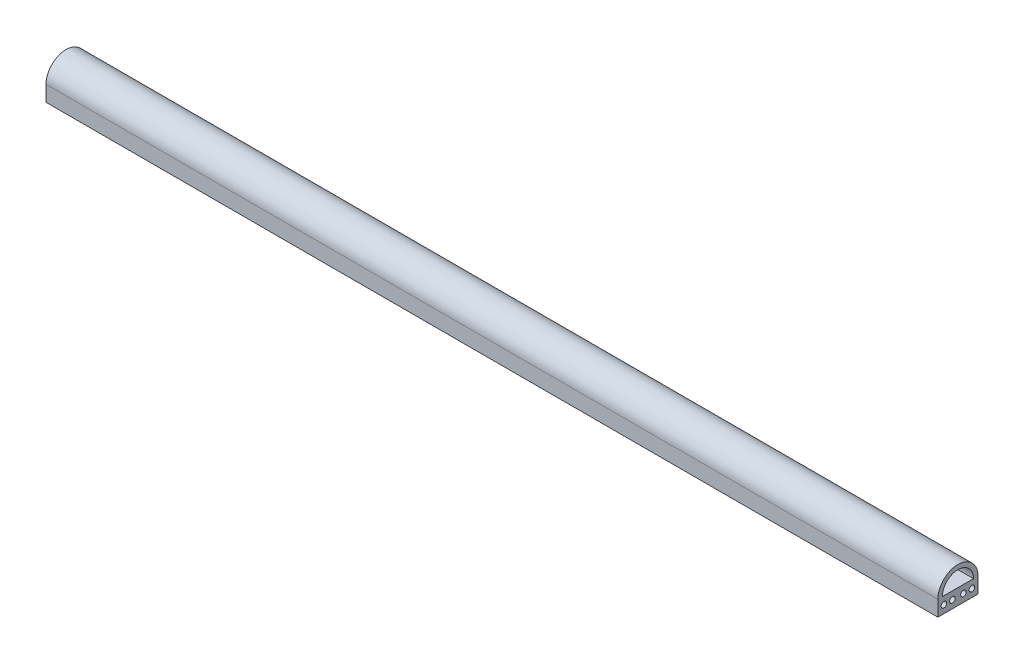
ISO-10303-21;
HEADER;
FILE_DESCRIPTION(('STEP AP214'),'2;1');
FILE_NAME('part.step','',(''),(''),'','','');
FILE_SCHEMA(('AUTOMOTIVE_DESIGN { 1 0 10303 214 1 1 1 1 }'));
ENDSEC;
DATA;
#1=APPLICATION_CONTEXT('core data for automotive mechanical design processes');
#2=APPLICATION_PROTOCOL_DEFINITION('international standard','automotive_design',2000,#1);
#3=PRODUCT_CONTEXT('',#1,'mechanical');
#4=PRODUCT('Part','Part','',(#3));
#5=PRODUCT_RELATED_PRODUCT_CATEGORY('part','',(#4));
#6=PRODUCT_DEFINITION_FORMATION('','',#4);
#7=PRODUCT_DEFINITION_CONTEXT('part definition',#1,'design');
#8=PRODUCT_DEFINITION('design','',#6,#7);
#9=PRODUCT_DEFINITION_SHAPE('','',#8);
#10=(LENGTH_UNIT() NAMED_UNIT(*) SI_UNIT(.MILLI.,.METRE.));
#11=(NAMED_UNIT(*) PLANE_ANGLE_UNIT() SI_UNIT($,.RADIAN.));
#12=(NAMED_UNIT(*) SI_UNIT($,.STERADIAN.) SOLID_ANGLE_UNIT());
#13=UNCERTAINTY_MEASURE_WITH_UNIT(LENGTH_MEASURE(1.E-05),#10,'distance_accuracy_value','');
#14=(GEOMETRIC_REPRESENTATION_CONTEXT(3) GLOBAL_UNCERTAINTY_ASSIGNED_CONTEXT((#13)) GLOBAL_UNIT_ASSIGNED_CONTEXT((#10,
#11,#12)) REPRESENTATION_CONTEXT('',''));
#15=CARTESIAN_POINT('',(0.,0.,0.));
#16=DIRECTION('',(0.,0.,1.));
#17=DIRECTION('',(1.,0.,0.));
#18=AXIS2_PLACEMENT_3D('',#15,#16,#17);
#19=CARTESIAN_POINT('',(-100.,3.5,0.));
#20=DIRECTION('',(1.,0.,0.));
#21=DIRECTION('',(0.,0.,-1.));
#22=AXIS2_PLACEMENT_3D('',#19,#20,#21);
#23=CYLINDRICAL_SURFACE('',#22,4.5);
#24=DIRECTION('',(1.,0.,0.));
#25=VECTOR('',#24,1.);
#26=CARTESIAN_POINT('',(-100.,3.5,4.5));
#27=LINE('',#26,#25);
#28=CARTESIAN_POINT('',(-100.,3.5,4.5));
#29=VERTEX_POINT('',#28);
#30=CARTESIAN_POINT('',(100.,3.5,4.5));
#31=VERTEX_POINT('',#30);
#32=EDGE_CURVE('E37',#29,#31,#27,.T.);
#33=ORIENTED_EDGE('',*,*,#32,.T.);
#34=CARTESIAN_POINT('',(100.,3.5,0.));
#35=DIRECTION('',(1.,0.,0.));
#36=DIRECTION('',(0.,0.,-1.));
#37=AXIS2_PLACEMENT_3D('',#34,#35,#36);
#38=CIRCLE('',#37,4.5);
#39=CARTESIAN_POINT('',(100.,3.5,-4.5));
#40=VERTEX_POINT('',#39);
#41=EDGE_CURVE('E116',#40,#31,#38,.T.);
#42=ORIENTED_EDGE('',*,*,#41,.F.);
#43=DIRECTION('',(1.,0.,0.));
#44=VECTOR('',#43,1.);
#45=CARTESIAN_POINT('',(-100.,3.5,-4.5));
#46=LINE('',#45,#44);
#47=CARTESIAN_POINT('',(-100.,3.5,-4.5));
#48=VERTEX_POINT('',#47);
#49=EDGE_CURVE('E11',#48,#40,#46,.T.);
#50=ORIENTED_EDGE('',*,*,#49,.F.);
#51=CARTESIAN_POINT('',(-100.,3.5,0.));
#52=DIRECTION('',(1.,0.,0.));
#53=DIRECTION('',(0.,0.,-1.));
#54=AXIS2_PLACEMENT_3D('',#51,#52,#53);
#55=CIRCLE('',#54,4.5);
#56=EDGE_CURVE('E143',#48,#29,#55,.T.);
#57=ORIENTED_EDGE('',*,*,#56,.T.);
#58=EDGE_LOOP('',(#33,#42,#50,#57));
#59=FACE_BOUND('',#58,.T.);
#60=ADVANCED_FACE('F34',(#59),#23,.T.);
#61=CARTESIAN_POINT('',(-100.,0.,-4.5));
#62=DIRECTION('',(0.,0.,-1.));
#63=DIRECTION('',(-1.,0.,0.));
#64=AXIS2_PLACEMENT_3D('',#61,#62,#63);
#65=PLANE('',#64);
#66=ORIENTED_EDGE('',*,*,#49,.T.);
#67=DIRECTION('',(0.,1.,0.));
#68=VECTOR('',#67,1.);
#69=CARTESIAN_POINT('',(100.,0.,-4.5));
#70=LINE('',#69,#68);
#71=CARTESIAN_POINT('',(100.,0.,-4.5));
#72=VERTEX_POINT('',#71);
#73=EDGE_CURVE('E125',#72,#40,#70,.T.);
#74=ORIENTED_EDGE('',*,*,#73,.F.);
#75=DIRECTION('',(1.,0.,0.));
#76=VECTOR('',#75,1.);
#77=CARTESIAN_POINT('',(-100.,0.,-4.5));
#78=LINE('',#77,#76);
#79=CARTESIAN_POINT('',(-100.,0.,-4.5));
#80=VERTEX_POINT('',#79);
#81=EDGE_CURVE('E42',#80,#72,#78,.T.);
#82=ORIENTED_EDGE('',*,*,#81,.F.);
#83=DIRECTION('',(0.,1.,0.));
#84=VECTOR('',#83,1.);
#85=CARTESIAN_POINT('',(-100.,0.,-4.5));
#86=LINE('',#85,#84);
#87=EDGE_CURVE('E150',#80,#48,#86,.T.);
#88=ORIENTED_EDGE('',*,*,#87,.T.);
#89=EDGE_LOOP('',(#66,#74,#82,#88));
#90=FACE_BOUND('',#89,.T.);
#91=ADVANCED_FACE('F164',(#90),#65,.T.);
#92=CARTESIAN_POINT('',(-100.,0.,-4.5));
#93=DIRECTION('',(0.,-1.,0.));
#94=DIRECTION('',(0.,0.,-1.));
#95=AXIS2_PLACEMENT_3D('',#92,#93,#94);
#96=PLANE('',#95);
#97=ORIENTED_EDGE('',*,*,#81,.T.);
#98=DIRECTION('',(0.,0.,-1.));
#99=VECTOR('',#98,1.);
#100=CARTESIAN_POINT('',(100.,0.,4.5));
#101=LINE('',#100,#99);
#102=CARTESIAN_POINT('',(100.,0.,4.5));
#103=VERTEX_POINT('',#102);
#104=EDGE_CURVE('E122',#103,#72,#101,.T.);
#105=ORIENTED_EDGE('',*,*,#104,.F.);
#106=DIRECTION('',(1.,0.,0.));
#107=VECTOR('',#106,1.);
#108=CARTESIAN_POINT('',(-100.,0.,4.5));
#109=LINE('',#108,#107);
#110=CARTESIAN_POINT('',(-100.,0.,4.5));
#111=VERTEX_POINT('',#110);
#112=EDGE_CURVE('E153',#111,#103,#109,.T.);
#113=ORIENTED_EDGE('',*,*,#112,.F.);
#114=DIRECTION('',(0.,0.,-1.));
#115=VECTOR('',#114,1.);
#116=CARTESIAN_POINT('',(-100.,0.,4.5));
#117=LINE('',#116,#115);
#118=EDGE_CURVE('E148',#111,#80,#117,.T.);
#119=ORIENTED_EDGE('',*,*,#118,.T.);
#120=EDGE_LOOP('',(#97,#105,#113,#119));
#121=FACE_BOUND('',#120,.T.);
#122=ADVANCED_FACE('F170',(#121),#96,.T.);
#123=CARTESIAN_POINT('',(-100.,0.,4.5));
#124=DIRECTION('',(0.,0.,1.));
#125=DIRECTION('',(0.,-1.,0.));
#126=AXIS2_PLACEMENT_3D('',#123,#124,#125);
#127=PLANE('',#126);
#128=ORIENTED_EDGE('',*,*,#112,.T.);
#129=DIRECTION('',(0.,-1.,0.));
#130=VECTOR('',#129,1.);
#131=CARTESIAN_POINT('',(100.,0.,4.5));
#132=LINE('',#131,#130);
#133=EDGE_CURVE('E119',#31,#103,#132,.T.);
#134=ORIENTED_EDGE('',*,*,#133,.F.);
#135=ORIENTED_EDGE('',*,*,#32,.F.);
#136=DIRECTION('',(0.,-1.,0.));
#137=VECTOR('',#136,1.);
#138=CARTESIAN_POINT('',(-100.,0.,4.5));
#139=LINE('',#138,#137);
#140=EDGE_CURVE('E145',#29,#111,#139,.T.);
#141=ORIENTED_EDGE('',*,*,#140,.T.);
#142=EDGE_LOOP('',(#128,#134,#135,#141));
#143=FACE_BOUND('',#142,.T.);
#144=ADVANCED_FACE('F157',(#143),#127,.T.);
#145=CARTESIAN_POINT('',(-100.,3.5,0.));
#146=DIRECTION('',(1.,0.,0.));
#147=DIRECTION('',(0.,0.,-1.));
#148=AXIS2_PLACEMENT_3D('',#145,#146,#147);
#149=PLANE('',#148);
#150=DIRECTION('',(0.,0.,-1.));
#151=VECTOR('',#150,1.);
#152=CARTESIAN_POINT('',(-100.,3.5,-3.49072719459126));
#153=LINE('',#152,#151);
#154=CARTESIAN_POINT('',(-100.,3.5,3.49072719459126));
#155=VERTEX_POINT('',#154);
#156=CARTESIAN_POINT('',(-100.,3.5,-3.49072719459126));
#157=VERTEX_POINT('',#156);
#158=EDGE_CURVE('E129',#155,#157,#153,.T.);
#159=ORIENTED_EDGE('',*,*,#158,.T.);
#160=CARTESIAN_POINT('',(-100.,3.5,0.));
#161=DIRECTION('',(1.,0.,0.));
#162=DIRECTION('',(0.,0.,-1.));
#163=AXIS2_PLACEMENT_3D('',#160,#161,#162);
#164=CIRCLE('',#163,3.49072719459126);
#165=EDGE_CURVE('E50',#157,#155,#164,.T.);
#166=ORIENTED_EDGE('',*,*,#165,.T.);
#167=EDGE_LOOP('',(#159,#166));
#168=FACE_BOUND('',#167,.T.);
#169=CARTESIAN_POINT('',(-100.,1.75,-3.13405881315633));
#170=DIRECTION('',(1.,0.,0.));
#171=DIRECTION('',(0.,0.,1.));
#172=AXIS2_PLACEMENT_3D('',#169,#170,#171);
#173=CIRCLE('',#172,0.625);
#174=CARTESIAN_POINT('',(-100.,1.75,-2.50905881315633));
#175=VERTEX_POINT('',#174);
#176=EDGE_CURVE('E94',#175,#175,#173,.T.);
#177=ORIENTED_EDGE('',*,*,#176,.T.);
#178=EDGE_LOOP('',(#177));
#179=FACE_BOUND('',#178,.T.);
#180=CARTESIAN_POINT('',(-100.,1.75,-1.22483394782814));
#181=DIRECTION('',(1.,0.,0.));
#182=DIRECTION('',(0.,0.,1.));
#183=AXIS2_PLACEMENT_3D('',#180,#181,#182);
#184=CIRCLE('',#183,0.625);
#185=CARTESIAN_POINT('',(-100.,1.75,-0.599833947828144));
#186=VERTEX_POINT('',#185);
#187=EDGE_CURVE('E134',#186,#186,#184,.T.);
#188=ORIENTED_EDGE('',*,*,#187,.T.);
#189=EDGE_LOOP('',(#188));
#190=FACE_BOUND('',#189,.T.);
#191=CARTESIAN_POINT('',(-100.,1.75,1.22483394782814));
#192=DIRECTION('',(1.,0.,0.));
#193=DIRECTION('',(0.,0.,-1.));
#194=AXIS2_PLACEMENT_3D('',#191,#192,#193);
#195=CIRCLE('',#194,0.625);
#196=CARTESIAN_POINT('',(-100.,1.75,0.599833947828144));
#197=VERTEX_POINT('',#196);
#198=EDGE_CURVE('E137',#197,#197,#195,.T.);
#199=ORIENTED_EDGE('',*,*,#198,.T.);
#200=EDGE_LOOP('',(#199));
#201=FACE_BOUND('',#200,.T.);
#202=CARTESIAN_POINT('',(-100.,1.75,3.13405881315633));
#203=DIRECTION('',(1.,0.,0.));
#204=DIRECTION('',(0.,0.,-1.));
#205=AXIS2_PLACEMENT_3D('',#202,#203,#204);
#206=CIRCLE('',#205,0.625);
#207=CARTESIAN_POINT('',(-100.,1.75,2.50905881315633));
#208=VERTEX_POINT('',#207);
#209=EDGE_CURVE('E140',#208,#208,#206,.T.);
#210=ORIENTED_EDGE('',*,*,#209,.T.);
#211=EDGE_LOOP('',(#210));
#212=FACE_BOUND('',#211,.T.);
#213=ORIENTED_EDGE('',*,*,#56,.F.);
#214=ORIENTED_EDGE('',*,*,#87,.F.);
#215=ORIENTED_EDGE('',*,*,#118,.F.);
#216=ORIENTED_EDGE('',*,*,#140,.F.);
#217=EDGE_LOOP('',(#213,#214,#215,#216));
#218=FACE_BOUND('',#217,.T.);
#219=ADVANCED_FACE('F168',(#168,#179,#190,#201,#212,#218),#149,.F.);
#220=CARTESIAN_POINT('',(-100.,1.75,3.13405881315633));
#221=DIRECTION('',(1.,0.,0.));
#222=DIRECTION('',(0.,0.,-1.));
#223=AXIS2_PLACEMENT_3D('',#220,#221,#222);
#224=CYLINDRICAL_SURFACE('',#223,0.625);
#225=ORIENTED_EDGE('',*,*,#209,.F.);
#226=EDGE_LOOP('',(#225));
#227=FACE_BOUND('',#226,.T.);
#228=CARTESIAN_POINT('',(100.,1.75,3.13405881315633));
#229=DIRECTION('',(1.,0.,0.));
#230=DIRECTION('',(0.,0.,-1.));
#231=AXIS2_PLACEMENT_3D('',#228,#229,#230);
#232=CIRCLE('',#231,0.625);
#233=CARTESIAN_POINT('',(100.,1.75,2.50905881315633));
#234=VERTEX_POINT('',#233);
#235=EDGE_CURVE('E113',#234,#234,#232,.T.);
#236=ORIENTED_EDGE('',*,*,#235,.T.);
#237=EDGE_LOOP('',(#236));
#238=FACE_BOUND('',#237,.T.);
#239=ADVANCED_FACE('F205',(#227,#238),#224,.F.);
#240=CARTESIAN_POINT('',(-100.,1.75,1.22483394782814));
#241=DIRECTION('',(1.,0.,0.));
#242=DIRECTION('',(0.,0.,-1.));
#243=AXIS2_PLACEMENT_3D('',#240,#241,#242);
#244=CYLINDRICAL_SURFACE('',#243,0.625);
#245=ORIENTED_EDGE('',*,*,#198,.F.);
#246=EDGE_LOOP('',(#245));
#247=FACE_BOUND('',#246,.T.);
#248=CARTESIAN_POINT('',(100.,1.75,1.22483394782814));
#249=DIRECTION('',(1.,0.,0.));
#250=DIRECTION('',(0.,0.,-1.));
#251=AXIS2_PLACEMENT_3D('',#248,#249,#250);
#252=CIRCLE('',#251,0.625);
#253=CARTESIAN_POINT('',(100.,1.75,0.599833947828144));
#254=VERTEX_POINT('',#253);
#255=EDGE_CURVE('E110',#254,#254,#252,.T.);
#256=ORIENTED_EDGE('',*,*,#255,.T.);
#257=EDGE_LOOP('',(#256));
#258=FACE_BOUND('',#257,.T.);
#259=ADVANCED_FACE('F215',(#247,#258),#244,.F.);
#260=CARTESIAN_POINT('',(-100.,1.75,-1.22483394782814));
#261=DIRECTION('',(1.,0.,0.));
#262=DIRECTION('',(0.,0.,-1.));
#263=AXIS2_PLACEMENT_3D('',#260,#261,#262);
#264=CYLINDRICAL_SURFACE('',#263,0.625);
#265=ORIENTED_EDGE('',*,*,#187,.F.);
#266=EDGE_LOOP('',(#265));
#267=FACE_BOUND('',#266,.T.);
#268=CARTESIAN_POINT('',(100.,1.75,-1.22483394782814));
#269=DIRECTION('',(1.,0.,0.));
#270=DIRECTION('',(0.,0.,1.));
#271=AXIS2_PLACEMENT_3D('',#268,#269,#270);
#272=CIRCLE('',#271,0.625);
#273=CARTESIAN_POINT('',(100.,1.75,-0.599833947828144));
#274=VERTEX_POINT('',#273);
#275=EDGE_CURVE('E107',#274,#274,#272,.T.);
#276=ORIENTED_EDGE('',*,*,#275,.T.);
#277=EDGE_LOOP('',(#276));
#278=FACE_BOUND('',#277,.T.);
#279=ADVANCED_FACE('F225',(#267,#278),#264,.F.);
#280=CARTESIAN_POINT('',(-100.,1.75,-3.13405881315633));
#281=DIRECTION('',(1.,0.,0.));
#282=DIRECTION('',(0.,0.,-1.));
#283=AXIS2_PLACEMENT_3D('',#280,#281,#282);
#284=CYLINDRICAL_SURFACE('',#283,0.625);
#285=ORIENTED_EDGE('',*,*,#176,.F.);
#286=EDGE_LOOP('',(#285));
#287=FACE_BOUND('',#286,.T.);
#288=CARTESIAN_POINT('',(100.,1.75,-3.13405881315633));
#289=DIRECTION('',(1.,0.,0.));
#290=DIRECTION('',(0.,0.,1.));
#291=AXIS2_PLACEMENT_3D('',#288,#289,#290);
#292=CIRCLE('',#291,0.625);
#293=CARTESIAN_POINT('',(100.,1.75,-2.50905881315633));
#294=VERTEX_POINT('',#293);
#295=EDGE_CURVE('E100',#294,#294,#292,.T.);
#296=ORIENTED_EDGE('',*,*,#295,.T.);
#297=EDGE_LOOP('',(#296));
#298=FACE_BOUND('',#297,.T.);
#299=ADVANCED_FACE('F235',(#287,#298),#284,.F.);
#300=CARTESIAN_POINT('',(-100.,3.5,0.));
#301=DIRECTION('',(1.,0.,0.));
#302=DIRECTION('',(0.,0.,-1.));
#303=AXIS2_PLACEMENT_3D('',#300,#301,#302);
#304=CYLINDRICAL_SURFACE('',#303,3.49072719459126);
#305=DIRECTION('',(1.,0.,0.));
#306=VECTOR('',#305,1.);
#307=CARTESIAN_POINT('',(-100.,3.5,-3.49072719459126));
#308=LINE('',#307,#306);
#309=CARTESIAN_POINT('',(100.,3.5,-3.49072719459126));
#310=VERTEX_POINT('',#309);
#311=EDGE_CURVE('E85',#157,#310,#308,.T.);
#312=ORIENTED_EDGE('',*,*,#311,.T.);
#313=CARTESIAN_POINT('',(100.,3.5,0.));
#314=DIRECTION('',(1.,0.,0.));
#315=DIRECTION('',(0.,0.,-1.));
#316=AXIS2_PLACEMENT_3D('',#313,#314,#315);
#317=CIRCLE('',#316,3.49072719459126);
#318=CARTESIAN_POINT('',(100.,3.5,3.49072719459126));
#319=VERTEX_POINT('',#318);
#320=EDGE_CURVE('E89',#310,#319,#317,.T.);
#321=ORIENTED_EDGE('',*,*,#320,.T.);
#322=DIRECTION('',(1.,0.,0.));
#323=VECTOR('',#322,1.);
#324=CARTESIAN_POINT('',(-100.,3.5,3.49072719459126));
#325=LINE('',#324,#323);
#326=EDGE_CURVE('E95',#155,#319,#325,.T.);
#327=ORIENTED_EDGE('',*,*,#326,.F.);
#328=ORIENTED_EDGE('',*,*,#165,.F.);
#329=EDGE_LOOP('',(#312,#321,#327,#328));
#330=FACE_BOUND('',#329,.T.);
#331=ADVANCED_FACE('F87',(#330),#304,.F.);
#332=CARTESIAN_POINT('',(-100.,3.5,-3.49072719459126));
#333=DIRECTION('',(0.,-1.,0.));
#334=DIRECTION('',(0.,0.,-1.));
#335=AXIS2_PLACEMENT_3D('',#332,#333,#334);
#336=PLANE('',#335);
#337=ORIENTED_EDGE('',*,*,#326,.T.);
#338=DIRECTION('',(0.,0.,-1.));
#339=VECTOR('',#338,1.);
#340=CARTESIAN_POINT('',(100.,3.5,-3.49072719459126));
#341=LINE('',#340,#339);
#342=EDGE_CURVE('E97',#319,#310,#341,.T.);
#343=ORIENTED_EDGE('',*,*,#342,.T.);
#344=ORIENTED_EDGE('',*,*,#311,.F.);
#345=ORIENTED_EDGE('',*,*,#158,.F.);
#346=EDGE_LOOP('',(#337,#343,#344,#345));
#347=FACE_BOUND('',#346,.T.);
#348=ADVANCED_FACE('F98',(#347),#336,.F.);
#349=CARTESIAN_POINT('',(100.,3.5,0.));
#350=DIRECTION('',(1.,0.,0.));
#351=DIRECTION('',(0.,0.,-1.));
#352=AXIS2_PLACEMENT_3D('',#349,#350,#351);
#353=PLANE('',#352);
#354=ORIENTED_EDGE('',*,*,#275,.F.);
#355=EDGE_LOOP('',(#354));
#356=FACE_BOUND('',#355,.T.);
#357=ORIENTED_EDGE('',*,*,#235,.F.);
#358=EDGE_LOOP('',(#357));
#359=FACE_BOUND('',#358,.T.);
#360=ORIENTED_EDGE('',*,*,#41,.T.);
#361=ORIENTED_EDGE('',*,*,#133,.T.);
#362=ORIENTED_EDGE('',*,*,#104,.T.);
#363=ORIENTED_EDGE('',*,*,#73,.T.);
#364=EDGE_LOOP('',(#360,#361,#362,#363));
#365=FACE_BOUND('',#364,.T.);
#366=ORIENTED_EDGE('',*,*,#255,.F.);
#367=EDGE_LOOP('',(#366));
#368=FACE_BOUND('',#367,.T.);
#369=ORIENTED_EDGE('',*,*,#295,.F.);
#370=EDGE_LOOP('',(#369));
#371=FACE_BOUND('',#370,.T.);
#372=ORIENTED_EDGE('',*,*,#342,.F.);
#373=ORIENTED_EDGE('',*,*,#320,.F.);
#374=EDGE_LOOP('',(#372,#373));
#375=FACE_BOUND('',#374,.T.);
#376=ADVANCED_FACE('F102',(#356,#359,#365,#368,#371,#375),#353,.T.);
#377=CLOSED_SHELL('',(#60,#91,#122,#144,#219,#239,#259,#279,#299,#331,#348,#376));
#378=MANIFOLD_SOLID_BREP('B2',#377);
#379=ADVANCED_BREP_SHAPE_REPRESENTATION('',(#18,#378),#14);
#380=SHAPE_DEFINITION_REPRESENTATION(#9,#379);
ENDSEC;
END-ISO-10303-21;
